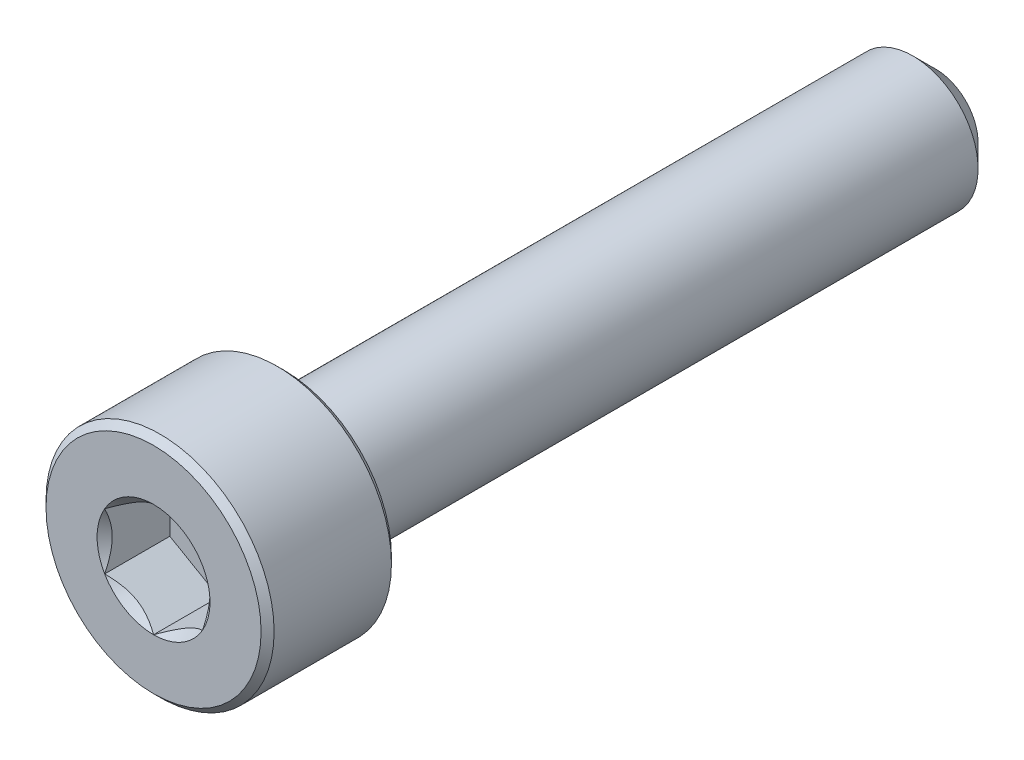
ISO-10303-21;
HEADER;
FILE_DESCRIPTION(('STEP AP214'),'2;1');
FILE_NAME('part.step','',(''),(''),'','','');
FILE_SCHEMA(('AUTOMOTIVE_DESIGN { 1 0 10303 214 1 1 1 1 }'));
ENDSEC;
DATA;
#1=APPLICATION_CONTEXT('core data for automotive mechanical design processes');
#2=APPLICATION_PROTOCOL_DEFINITION('international standard','automotive_design',2000,#1);
#3=PRODUCT_CONTEXT('',#1,'mechanical');
#4=PRODUCT('Part','Part','',(#3));
#5=PRODUCT_RELATED_PRODUCT_CATEGORY('part','',(#4));
#6=PRODUCT_DEFINITION_FORMATION('','',#4);
#7=PRODUCT_DEFINITION_CONTEXT('part definition',#1,'design');
#8=PRODUCT_DEFINITION('design','',#6,#7);
#9=PRODUCT_DEFINITION_SHAPE('','',#8);
#10=(LENGTH_UNIT() NAMED_UNIT(*) SI_UNIT(.MILLI.,.METRE.));
#11=(NAMED_UNIT(*) PLANE_ANGLE_UNIT() SI_UNIT($,.RADIAN.));
#12=(NAMED_UNIT(*) SI_UNIT($,.STERADIAN.) SOLID_ANGLE_UNIT());
#13=UNCERTAINTY_MEASURE_WITH_UNIT(LENGTH_MEASURE(1.E-05),#10,'distance_accuracy_value','');
#14=(GEOMETRIC_REPRESENTATION_CONTEXT(3) GLOBAL_UNCERTAINTY_ASSIGNED_CONTEXT((#13)) GLOBAL_UNIT_ASSIGNED_CONTEXT((#10,
#11,#12)) REPRESENTATION_CONTEXT('',''));
#15=CARTESIAN_POINT('',(0.,0.,0.));
#16=DIRECTION('',(0.,0.,1.));
#17=DIRECTION('',(1.,0.,0.));
#18=AXIS2_PLACEMENT_3D('',#15,#16,#17);
#19=CARTESIAN_POINT('',(0.,3.3,12.));
#20=DIRECTION('',(0.,0.,1.));
#21=DIRECTION('',(1.,0.,0.));
#22=AXIS2_PLACEMENT_3D('',#19,#20,#21);
#23=PLANE('',#22);
#24=CARTESIAN_POINT('',(0.,0.,12.));
#25=DIRECTION('',(0.,0.,1.));
#26=DIRECTION('',(1.,0.,0.));
#27=AXIS2_PLACEMENT_3D('',#24,#25,#26);
#28=CIRCLE('',#27,1.73205080756888);
#29=CARTESIAN_POINT('',(1.5,0.86602540378444,12.));
#30=VERTEX_POINT('',#29);
#31=CARTESIAN_POINT('',(0.,1.73205080756888,12.));
#32=VERTEX_POINT('',#31);
#33=EDGE_CURVE('E98',#30,#32,#28,.T.);
#34=ORIENTED_EDGE('',*,*,#33,.F.);
#35=CARTESIAN_POINT('',(1.5,-0.86602540378444,12.));
#36=VERTEX_POINT('',#35);
#37=EDGE_CURVE('E58',#36,#30,#28,.T.);
#38=ORIENTED_EDGE('',*,*,#37,.F.);
#39=CARTESIAN_POINT('',(0.,-1.73205080756888,12.));
#40=VERTEX_POINT('',#39);
#41=EDGE_CURVE('E308',#40,#36,#28,.T.);
#42=ORIENTED_EDGE('',*,*,#41,.F.);
#43=CARTESIAN_POINT('',(-1.5,-0.866025403784437,12.));
#44=VERTEX_POINT('',#43);
#45=EDGE_CURVE('E65',#44,#40,#28,.T.);
#46=ORIENTED_EDGE('',*,*,#45,.F.);
#47=CARTESIAN_POINT('',(-1.5,0.86602540378444,12.));
#48=VERTEX_POINT('',#47);
#49=EDGE_CURVE('E137',#48,#44,#28,.T.);
#50=ORIENTED_EDGE('',*,*,#49,.F.);
#51=EDGE_CURVE('E108',#32,#48,#28,.T.);
#52=ORIENTED_EDGE('',*,*,#51,.F.);
#53=EDGE_LOOP('',(#34,#38,#42,#46,#50,#52));
#54=FACE_BOUND('',#53,.T.);
#55=CARTESIAN_POINT('',(0.,0.,12.));
#56=DIRECTION('',(0.,0.,-1.));
#57=DIRECTION('',(-1.,0.,0.));
#58=AXIS2_PLACEMENT_3D('',#55,#56,#57);
#59=CIRCLE('',#58,3.3);
#60=CARTESIAN_POINT('',(-3.3,0.,12.));
#61=VERTEX_POINT('',#60);
#62=EDGE_CURVE('E52',#61,#61,#59,.T.);
#63=ORIENTED_EDGE('',*,*,#62,.F.);
#64=EDGE_LOOP('',(#63));
#65=FACE_BOUND('',#64,.T.);
#66=ADVANCED_FACE('F38',(#54,#65),#23,.T.);
#67=CARTESIAN_POINT('',(0.,0.,11.8));
#68=DIRECTION('',(0.,0.,-1.));
#69=DIRECTION('',(-1.,0.,0.));
#70=AXIS2_PLACEMENT_3D('',#67,#68,#69);
#71=CONICAL_SURFACE('',#70,3.5,0.785398163397449);
#72=ORIENTED_EDGE('',*,*,#62,.T.);
#73=EDGE_LOOP('',(#72));
#74=FACE_BOUND('',#73,.T.);
#75=CARTESIAN_POINT('',(0.,0.,11.8));
#76=DIRECTION('',(0.,0.,-1.));
#77=DIRECTION('',(-1.,0.,0.));
#78=AXIS2_PLACEMENT_3D('',#75,#76,#77);
#79=CIRCLE('',#78,3.5);
#80=CARTESIAN_POINT('',(-3.5,0.,11.8));
#81=VERTEX_POINT('',#80);
#82=EDGE_CURVE('E240',#81,#81,#79,.T.);
#83=ORIENTED_EDGE('',*,*,#82,.F.);
#84=EDGE_LOOP('',(#83));
#85=FACE_BOUND('',#84,.T.);
#86=ADVANCED_FACE('F247',(#74,#85),#71,.T.);
#87=CARTESIAN_POINT('',(0.,0.,-12.));
#88=DIRECTION('',(0.,0.,-1.));
#89=DIRECTION('',(-1.,0.,0.));
#90=AXIS2_PLACEMENT_3D('',#87,#88,#89);
#91=CYLINDRICAL_SURFACE('',#90,3.5);
#92=ORIENTED_EDGE('',*,*,#82,.T.);
#93=EDGE_LOOP('',(#92));
#94=FACE_BOUND('',#93,.T.);
#95=CARTESIAN_POINT('',(0.,0.,8.2));
#96=DIRECTION('',(0.,0.,-1.));
#97=DIRECTION('',(-1.,0.,0.));
#98=AXIS2_PLACEMENT_3D('',#95,#96,#97);
#99=CIRCLE('',#98,3.5);
#100=CARTESIAN_POINT('',(-3.5,0.,8.2));
#101=VERTEX_POINT('',#100);
#102=EDGE_CURVE('E236',#101,#101,#99,.T.);
#103=ORIENTED_EDGE('',*,*,#102,.F.);
#104=EDGE_LOOP('',(#103));
#105=FACE_BOUND('',#104,.T.);
#106=ADVANCED_FACE('F253',(#94,#105),#91,.T.);
#107=CARTESIAN_POINT('',(0.,0.,8.));
#108=DIRECTION('',(0.,0.,1.));
#109=DIRECTION('',(1.,0.,0.));
#110=AXIS2_PLACEMENT_3D('',#107,#108,#109);
#111=CONICAL_SURFACE('',#110,3.3,0.785398163397445);
#112=ORIENTED_EDGE('',*,*,#102,.T.);
#113=EDGE_LOOP('',(#112));
#114=FACE_BOUND('',#113,.T.);
#115=CARTESIAN_POINT('',(0.,0.,8.));
#116=DIRECTION('',(0.,0.,-1.));
#117=DIRECTION('',(-1.,0.,0.));
#118=AXIS2_PLACEMENT_3D('',#115,#116,#117);
#119=CIRCLE('',#118,3.3);
#120=CARTESIAN_POINT('',(-3.3,0.,8.));
#121=VERTEX_POINT('',#120);
#122=EDGE_CURVE('E232',#121,#121,#119,.T.);
#123=ORIENTED_EDGE('',*,*,#122,.F.);
#124=EDGE_LOOP('',(#123));
#125=FACE_BOUND('',#124,.T.);
#126=ADVANCED_FACE('F257',(#114,#125),#111,.T.);
#127=CARTESIAN_POINT('',(0.,3.3,8.));
#128=DIRECTION('',(0.,0.,-1.));
#129=DIRECTION('',(-1.,0.,0.));
#130=AXIS2_PLACEMENT_3D('',#127,#128,#129);
#131=PLANE('',#130);
#132=ORIENTED_EDGE('',*,*,#122,.T.);
#133=EDGE_LOOP('',(#132));
#134=FACE_BOUND('',#133,.T.);
#135=CARTESIAN_POINT('',(0.,0.,8.));
#136=DIRECTION('',(0.,0.,-1.));
#137=DIRECTION('',(-1.,0.,0.));
#138=AXIS2_PLACEMENT_3D('',#135,#136,#137);
#139=CIRCLE('',#138,2.);
#140=CARTESIAN_POINT('',(-2.,0.,8.));
#141=VERTEX_POINT('',#140);
#142=EDGE_CURVE('E228',#141,#141,#139,.T.);
#143=ORIENTED_EDGE('',*,*,#142,.F.);
#144=EDGE_LOOP('',(#143));
#145=FACE_BOUND('',#144,.T.);
#146=ADVANCED_FACE('F263',(#134,#145),#131,.T.);
#147=CARTESIAN_POINT('',(0.,0.,-12.));
#148=DIRECTION('',(0.,0.,-1.));
#149=DIRECTION('',(-1.,0.,0.));
#150=AXIS2_PLACEMENT_3D('',#147,#148,#149);
#151=CYLINDRICAL_SURFACE('',#150,2.);
#152=ORIENTED_EDGE('',*,*,#142,.T.);
#153=EDGE_LOOP('',(#152));
#154=FACE_BOUND('',#153,.T.);
#155=CARTESIAN_POINT('',(0.,0.,-11.3));
#156=DIRECTION('',(0.,0.,-1.));
#157=DIRECTION('',(-1.,0.,0.));
#158=AXIS2_PLACEMENT_3D('',#155,#156,#157);
#159=CIRCLE('',#158,2.);
#160=CARTESIAN_POINT('',(-2.,0.,-11.3));
#161=VERTEX_POINT('',#160);
#162=EDGE_CURVE('E224',#161,#161,#159,.T.);
#163=ORIENTED_EDGE('',*,*,#162,.F.);
#164=EDGE_LOOP('',(#163));
#165=FACE_BOUND('',#164,.T.);
#166=ADVANCED_FACE('F267',(#154,#165),#151,.T.);
#167=CARTESIAN_POINT('',(0.,0.,-12.));
#168=DIRECTION('',(0.,0.,1.));
#169=DIRECTION('',(1.,0.,0.));
#170=AXIS2_PLACEMENT_3D('',#167,#168,#169);
#171=CONICAL_SURFACE('',#170,1.3,0.785398163397442);
#172=ORIENTED_EDGE('',*,*,#162,.T.);
#173=EDGE_LOOP('',(#172));
#174=FACE_BOUND('',#173,.T.);
#175=CARTESIAN_POINT('',(0.,0.,-12.));
#176=DIRECTION('',(0.,0.,-1.));
#177=DIRECTION('',(-1.,0.,0.));
#178=AXIS2_PLACEMENT_3D('',#175,#176,#177);
#179=CIRCLE('',#178,1.3);
#180=CARTESIAN_POINT('',(-1.3,0.,-12.));
#181=VERTEX_POINT('',#180);
#182=EDGE_CURVE('E207',#181,#181,#179,.T.);
#183=ORIENTED_EDGE('',*,*,#182,.F.);
#184=EDGE_LOOP('',(#183));
#185=FACE_BOUND('',#184,.T.);
#186=ADVANCED_FACE('F270',(#174,#185),#171,.T.);
#187=CARTESIAN_POINT('',(0.,1.3,-12.));
#188=DIRECTION('',(0.,0.,-1.));
#189=DIRECTION('',(-1.,0.,0.));
#190=AXIS2_PLACEMENT_3D('',#187,#188,#189);
#191=PLANE('',#190);
#192=ORIENTED_EDGE('',*,*,#182,.T.);
#193=EDGE_LOOP('',(#192));
#194=FACE_BOUND('',#193,.T.);
#195=ADVANCED_FACE('F173',(#194),#191,.T.);
#196=CARTESIAN_POINT('',(0.,0.,12.));
#197=DIRECTION('',(0.,0.,1.));
#198=DIRECTION('',(1.,0.,0.));
#199=AXIS2_PLACEMENT_3D('',#196,#197,#198);
#200=CONICAL_SURFACE('',#199,1.73205080756888,0.78539816339745);
#201=ORIENTED_EDGE('',*,*,#51,.T.);
#202=CARTESIAN_POINT('',(0.000200000000000415,1.73216627762272,12.0001154816001));
#203=CARTESIAN_POINT('',(-0.0513677907370751,1.70239359975915,11.9703654760673));
#204=CARTESIAN_POINT('',(-0.1037979176652,1.67212305186355,11.9423624839103));
#205=CARTESIAN_POINT('',(-0.210709034055596,1.61039789003619,11.8910892304401));
#206=CARTESIAN_POINT('',(-0.26520019581466,1.57893740312614,11.8678475050444));
#207=CARTESIAN_POINT('',(-0.375079081357248,1.51549879897987,11.8280337289922));
#208=CARTESIAN_POINT('',(-0.430438809095199,1.4835368452681,11.8113615856709));
#209=CARTESIAN_POINT('',(-0.54237725747715,1.41890915196211,11.7856744568181));
#210=CARTESIAN_POINT('',(-0.598952556553008,1.38624538781118,11.7766402904789));
#211=CARTESIAN_POINT('',(-0.69645538951644,1.329952100953,11.7684890812269));
#212=CARTESIAN_POINT('',(-0.737256908280465,1.30639533311124,11.7672822529892));
#213=CARTESIAN_POINT('',(-0.818787969615858,1.25932335290194,11.7693140571623));
#214=CARTESIAN_POINT('',(-0.859517494314629,1.23580815085313,11.7725536707483));
#215=CARTESIAN_POINT('',(-0.940584402163415,1.18900414978427,11.783291985982));
#216=CARTESIAN_POINT('',(-0.980921384598287,1.1657155821172,11.7907946530187));
#217=CARTESIAN_POINT('',(-1.06091833691403,1.11952932016335,11.8096516119283));
#218=CARTESIAN_POINT('',(-1.10057800851621,1.09663179808786,11.8210075570186));
#219=CARTESIAN_POINT('',(-1.20216313477448,1.03798159809698,11.8547216475927));
#220=CARTESIAN_POINT('',(-1.26345855370969,1.00259267147465,11.8796218490934));
#221=CARTESIAN_POINT('',(-1.35358562846331,0.950557780604375,11.9216566532716));
#222=CARTESIAN_POINT('',(-1.38328513990772,0.933410759677148,11.9364251535591));
#223=CARTESIAN_POINT('',(-1.44213790138375,0.899432101996407,11.9673105659402));
#224=CARTESIAN_POINT('',(-1.47129140422064,0.88260031928571,11.9834268341217));
#225=CARTESIAN_POINT('',(-1.5002,0.865909933730601,12.0001154816001));
#226=B_SPLINE_CURVE_WITH_KNOTS('',3,(#202,#203,#204,#205,#206,#207,#208,#209,#210,#211,#212,
#213,#214,#215,#216,#217,#218,#219,#220,#221,#222,#223,#224,#225),.UNSPECIFIED.,.F.,.F.,(4,2,2,
2,2,2,2,2,2,2,2,4),(0.,0.199829143693304,0.400822987382388,0.59862372053818,0.795926240188889,
0.937113067959881,1.07833105577193,1.21968061668222,1.36109089931054,1.58570969637566,
1.69770705470964,1.80965120737194),.UNSPECIFIED.);
#227=EDGE_CURVE('E11',#32,#48,#226,.T.);
#228=ORIENTED_EDGE('',*,*,#227,.F.);
#229=EDGE_LOOP('',(#201,#228));
#230=FACE_BOUND('',#229,.T.);
#231=ADVANCED_FACE('F112',(#230),#200,.F.);
#232=ORIENTED_EDGE('',*,*,#49,.T.);
#233=CARTESIAN_POINT('',(-1.5,-1.70094076570699,12.5358115093375));
#234=CARTESIAN_POINT('',(-1.5,-1.65940339844307,12.5046624535631));
#235=CARTESIAN_POINT('',(-1.5,-1.61763176138548,12.4738266460381));
#236=CARTESIAN_POINT('',(-1.5,-1.53352581710889,12.4129100581704));
#237=CARTESIAN_POINT('',(-1.5,-1.49119136858461,12.3828294731344));
#238=CARTESIAN_POINT('',(-1.5,-1.36258344501966,12.2934848296331));
#239=CARTESIAN_POINT('',(-1.5,-1.27533705988673,12.2355978134878));
#240=CARTESIAN_POINT('',(-1.5,-1.09255216894207,12.1221956742968));
#241=CARTESIAN_POINT('',(-1.5,-0.996821581803493,12.0669865475731));
#242=CARTESIAN_POINT('',(-1.5,-0.800613082291591,11.9661637894456));
#243=CARTESIAN_POINT('',(-1.5,-0.700152604862087,11.9205178517796));
#244=CARTESIAN_POINT('',(-1.5,-0.549105960820993,11.8646825296987));
#245=CARTESIAN_POINT('',(-1.5,-0.50070074362804,11.8486143923262));
#246=CARTESIAN_POINT('',(-1.5,-0.402744695079411,11.8203677225147));
#247=CARTESIAN_POINT('',(-1.5,-0.353193782853662,11.8081894655512));
#248=CARTESIAN_POINT('',(-1.5,-0.254057869430009,11.7885509139904));
#249=CARTESIAN_POINT('',(-1.5,-0.204488814603775,11.7810113615859));
#250=CARTESIAN_POINT('',(-1.5,-0.104849462627796,11.7707932169289));
#251=CARTESIAN_POINT('',(-1.5,-0.0547792475757581,11.7681138411974));
#252=CARTESIAN_POINT('',(-1.5,0.0436737229088438,11.7678046268618));
#253=CARTESIAN_POINT('',(-1.5,0.0920560164094802,11.7700063307259));
#254=CARTESIAN_POINT('',(-1.5,0.188397733218518,11.7789725882362));
#255=CARTESIAN_POINT('',(-1.5,0.236357072029981,11.785738033594));
#256=CARTESIAN_POINT('',(-1.5,0.332310053939587,11.8035816390129));
#257=CARTESIAN_POINT('',(-1.5,0.380290051019947,11.8147320967868));
#258=CARTESIAN_POINT('',(-1.5,0.475204866701384,11.8407610618773));
#259=CARTESIAN_POINT('',(-1.5,0.522139781196709,11.8556392256008));
#260=CARTESIAN_POINT('',(-1.5,0.67113584923772,11.9084343926817));
#261=CARTESIAN_POINT('',(-1.5,0.771043708402958,11.9524144964364));
#262=CARTESIAN_POINT('',(-1.5,0.96615432077171,12.0501619481606));
#263=CARTESIAN_POINT('',(-1.5,1.06133841027247,12.1039647104964));
#264=CARTESIAN_POINT('',(-1.5,1.24322962123133,12.2149242663436));
#265=CARTESIAN_POINT('',(-1.5,1.33012275327054,12.2717798884629));
#266=CARTESIAN_POINT('',(-1.5,1.45814294533514,12.3596557398234));
#267=CARTESIAN_POINT('',(-1.5,1.50026316125082,12.3892542436258));
#268=CARTESIAN_POINT('',(-1.5,1.58392901779071,12.4492295725282));
#269=CARTESIAN_POINT('',(-1.5,1.62547481197907,12.4796061831648));
#270=CARTESIAN_POINT('',(-1.5,1.66678158585385,12.5103052870204));
#271=B_SPLINE_CURVE_WITH_KNOTS('',3,(#233,#234,#235,#236,#237,#238,#239,#240,#241,#242,#243,
#244,#245,#246,#247,#248,#249,#250,#251,#252,#253,#254,#255,#256,#257,#258,#259,#260,#261,#262,
#263,#264,#265,#266,#267,#268,#269,#270),.UNSPECIFIED.,.F.,.F.,(4,2,2,2,2,2,2,2,2,2,2,2,2,2,2,2,
2,2,4),(0.,0.155753948201002,0.311547769199352,0.625513832410581,0.956763614654479,
1.28687565594417,1.43975300144579,1.59264117109685,1.74283872260253,1.89301205954152,
2.03808349452257,2.1831832832956,2.33078307442231,2.47836926586908,2.80488410158813,
3.13260026706957,3.44396956433299,3.59840353500356,3.75279538879849),.UNSPECIFIED.);
#272=EDGE_CURVE('E107',#48,#44,#271,.F.);
#273=ORIENTED_EDGE('',*,*,#272,.F.);
#274=EDGE_LOOP('',(#232,#273));
#275=FACE_BOUND('',#274,.T.);
#276=ADVANCED_FACE('F285',(#275),#200,.F.);
#277=ORIENTED_EDGE('',*,*,#45,.T.);
#278=CARTESIAN_POINT('',(-1.5002,-0.865909933730601,12.0001154816001));
#279=CARTESIAN_POINT('',(-1.44863220926292,-0.895682611594166,11.9703654760673));
#280=CARTESIAN_POINT('',(-1.3962020823348,-0.925953159489765,11.9423624839103));
#281=CARTESIAN_POINT('',(-1.2892909659444,-0.987678321317123,11.8910892304401));
#282=CARTESIAN_POINT('',(-1.23479980418534,-1.01913880822717,11.8678475050444));
#283=CARTESIAN_POINT('',(-1.12492091864275,-1.08257741237344,11.8280337289922));
#284=CARTESIAN_POINT('',(-1.0695611909048,-1.11453936608521,11.8113615856709));
#285=CARTESIAN_POINT('',(-0.957622742522851,-1.1791670593912,11.7856744568181));
#286=CARTESIAN_POINT('',(-0.901047443446993,-1.21183082354213,11.7766402904789));
#287=CARTESIAN_POINT('',(-0.803544610483561,-1.26812411040032,11.7684890812269));
#288=CARTESIAN_POINT('',(-0.762743091719535,-1.29168087824208,11.7672822529892));
#289=CARTESIAN_POINT('',(-0.681212030384143,-1.33875285845138,11.7693140571623));
#290=CARTESIAN_POINT('',(-0.640482505685372,-1.36226806050018,11.7725536707483));
#291=CARTESIAN_POINT('',(-0.559415597836586,-1.40907206156905,11.783291985982));
#292=CARTESIAN_POINT('',(-0.519078615401714,-1.43236062923612,11.7907946530187));
#293=CARTESIAN_POINT('',(-0.439081663085971,-1.47854689118996,11.8096516119283));
#294=CARTESIAN_POINT('',(-0.399421991483794,-1.50144441326545,11.8210075570186));
#295=CARTESIAN_POINT('',(-0.297836865225516,-1.56009461325633,11.8547216475927));
#296=CARTESIAN_POINT('',(-0.236541446290312,-1.59548353987866,11.8796218490934));
#297=CARTESIAN_POINT('',(-0.146414371536687,-1.64751843074894,11.9216566532716));
#298=CARTESIAN_POINT('',(-0.116714860092283,-1.66466545167617,11.9364251535591));
#299=CARTESIAN_POINT('',(-0.0578620986162496,-1.69864410935691,11.9673105659402));
#300=CARTESIAN_POINT('',(-0.0287085957793634,-1.71547589206761,11.9834268341217));
#301=CARTESIAN_POINT('',(0.000199999999999558,-1.73216627762272,12.0001154816001));
#302=B_SPLINE_CURVE_WITH_KNOTS('',3,(#278,#279,#280,#281,#282,#283,#284,#285,#286,#287,#288,
#289,#290,#291,#292,#293,#294,#295,#296,#297,#298,#299,#300,#301),.UNSPECIFIED.,.F.,.F.,(4,2,2,
2,2,2,2,2,2,2,2,4),(0.,0.199829143693304,0.400822987382388,0.59862372053818,0.795926240188888,
0.93711306795988,1.07833105577193,1.21968061668222,1.36109089931054,1.58570969637565,
1.69770705470964,1.80965120737194),.UNSPECIFIED.);
#303=EDGE_CURVE('E149',#44,#40,#302,.T.);
#304=ORIENTED_EDGE('',*,*,#303,.F.);
#305=EDGE_LOOP('',(#277,#304));
#306=FACE_BOUND('',#305,.T.);
#307=ADVANCED_FACE('F289',(#306),#200,.F.);
#308=ORIENTED_EDGE('',*,*,#41,.T.);
#309=CARTESIAN_POINT('',(-0.000200000000000533,-1.73216627762272,12.0001154816001));
#310=CARTESIAN_POINT('',(0.051367790737075,-1.70239359975915,11.9703654760673));
#311=CARTESIAN_POINT('',(0.1037979176652,-1.67212305186355,11.9423624839103));
#312=CARTESIAN_POINT('',(0.210709034055596,-1.61039789003619,11.8910892304401));
#313=CARTESIAN_POINT('',(0.26520019581466,-1.57893740312614,11.8678475050444));
#314=CARTESIAN_POINT('',(0.375079081357248,-1.51549879897987,11.8280337289922));
#315=CARTESIAN_POINT('',(0.430438809095199,-1.4835368452681,11.8113615856709));
#316=CARTESIAN_POINT('',(0.54237725747715,-1.41890915196211,11.7856744568181));
#317=CARTESIAN_POINT('',(0.598952556553008,-1.38624538781118,11.7766402904789));
#318=CARTESIAN_POINT('',(0.69645538951644,-1.329952100953,11.7684890812269));
#319=CARTESIAN_POINT('',(0.737256908280465,-1.30639533311124,11.7672822529892));
#320=CARTESIAN_POINT('',(0.818787969615857,-1.25932335290194,11.7693140571623));
#321=CARTESIAN_POINT('',(0.859517494314629,-1.23580815085313,11.7725536707483));
#322=CARTESIAN_POINT('',(0.940584402163415,-1.18900414978427,11.783291985982));
#323=CARTESIAN_POINT('',(0.980921384598287,-1.1657155821172,11.7907946530187));
#324=CARTESIAN_POINT('',(1.06091833691403,-1.11952932016335,11.8096516119283));
#325=CARTESIAN_POINT('',(1.10057800851621,-1.09663179808786,11.8210075570186));
#326=CARTESIAN_POINT('',(1.20216313477448,-1.03798159809698,11.8547216475927));
#327=CARTESIAN_POINT('',(1.26345855370969,-1.00259267147465,11.8796218490934));
#328=CARTESIAN_POINT('',(1.35358562846331,-0.950557780604376,11.9216566532716));
#329=CARTESIAN_POINT('',(1.38328513990772,-0.933410759677149,11.9364251535591));
#330=CARTESIAN_POINT('',(1.44213790138375,-0.899432101996408,11.9673105659402));
#331=CARTESIAN_POINT('',(1.47129140422064,-0.882600319285711,11.9834268341217));
#332=CARTESIAN_POINT('',(1.5002,-0.865909933730602,12.0001154816001));
#333=B_SPLINE_CURVE_WITH_KNOTS('',3,(#309,#310,#311,#312,#313,#314,#315,#316,#317,#318,#319,
#320,#321,#322,#323,#324,#325,#326,#327,#328,#329,#330,#331,#332),.UNSPECIFIED.,.F.,.F.,(4,2,2,
2,2,2,2,2,2,2,2,4),(0.,0.199829143693305,0.400822987382388,0.598623720538181,0.795926240188889,
0.93711306795988,1.07833105577193,1.21968061668222,1.36109089931054,1.58570969637565,
1.69770705470963,1.80965120737194),.UNSPECIFIED.);
#334=EDGE_CURVE('E310',#40,#36,#333,.T.);
#335=ORIENTED_EDGE('',*,*,#334,.F.);
#336=EDGE_LOOP('',(#308,#335));
#337=FACE_BOUND('',#336,.T.);
#338=ADVANCED_FACE('F298',(#337),#200,.F.);
#339=ORIENTED_EDGE('',*,*,#37,.T.);
#340=CARTESIAN_POINT('',(1.5,-1.70094076506827,12.5358115088584));
#341=CARTESIAN_POINT('',(1.5,-1.65940339782208,12.5046624531024));
#342=CARTESIAN_POINT('',(1.5,-1.61763176078228,12.4738266455959));
#343=CARTESIAN_POINT('',(1.5,-1.53352581654145,12.4129100577648));
#344=CARTESIAN_POINT('',(1.5,-1.49119136803515,12.382829472747));
#345=CARTESIAN_POINT('',(1.5,-1.36258344452521,12.293484829301));
#346=CARTESIAN_POINT('',(1.5,-1.2753370594297,12.2355978131923));
#347=CARTESIAN_POINT('',(1.5,-1.09255216856664,12.1221956740766));
#348=CARTESIAN_POINT('',(1.5,-0.996821581472453,12.0669865473912));
#349=CARTESIAN_POINT('',(1.5,-0.800613082053125,11.9661637893348));
#350=CARTESIAN_POINT('',(1.5,-0.70015260467177,11.9205178517016));
#351=CARTESIAN_POINT('',(1.5,-0.549105960667007,11.8646825296453));
#352=CARTESIAN_POINT('',(1.5,-0.500700743459034,11.8486143922722));
#353=CARTESIAN_POINT('',(1.5,-0.402744694879906,11.8203677224624));
#354=CARTESIAN_POINT('',(1.5,-0.35319378263868,11.8081894655014));
#355=CARTESIAN_POINT('',(1.5,-0.254057869184596,11.7885509139489));
#356=CARTESIAN_POINT('',(1.5,-0.204488814343417,11.7810113615502));
#357=CARTESIAN_POINT('',(1.5,-0.104849462338083,11.7707932169081));
#358=CARTESIAN_POINT('',(1.5,-0.054779247271636,11.7681138411859));
#359=CARTESIAN_POINT('',(1.5,0.0436737232403028,11.767804626871));
#360=CARTESIAN_POINT('',(1.5,0.0920560167539032,11.7700063307466));
#361=CARTESIAN_POINT('',(1.5,0.188397733587633,11.7789725882818));
#362=CARTESIAN_POINT('',(1.5,0.236357072410824,11.7857380336531));
#363=CARTESIAN_POINT('',(1.5,0.332310054343575,11.8035816391));
#364=CARTESIAN_POINT('',(1.5,0.380290051435318,11.8147320968888));
#365=CARTESIAN_POINT('',(1.5,0.475204867138458,11.8407610620092));
#366=CARTESIAN_POINT('',(1.5,0.522139781644104,11.8556392257479));
#367=CARTESIAN_POINT('',(1.5,0.671135849783408,11.9084343929006));
#368=CARTESIAN_POINT('',(1.5,0.771043709031689,11.9524144967216));
#369=CARTESIAN_POINT('',(1.5,0.96615432156016,12.0501619485856));
#370=CARTESIAN_POINT('',(1.5,1.06133841113756,12.103964710995));
#371=CARTESIAN_POINT('',(1.5,1.24322962223427,12.214924266983));
#372=CARTESIAN_POINT('',(1.5,1.33012275433518,12.2717798891689));
#373=CARTESIAN_POINT('',(1.5,1.45814294649102,12.359655740629));
#374=CARTESIAN_POINT('',(1.5,1.50026316243668,12.3892542444644));
#375=CARTESIAN_POINT('',(1.5,1.58392901903632,12.4492295734326));
#376=CARTESIAN_POINT('',(1.5,1.62547481325447,12.4796061841021));
#377=CARTESIAN_POINT('',(1.5,1.66678158715899,12.5103052879905));
#378=B_SPLINE_CURVE_WITH_KNOTS('',3,(#340,#341,#342,#343,#344,#345,#346,#347,#348,#349,#350,
#351,#352,#353,#354,#355,#356,#357,#358,#359,#360,#361,#362,#363,#364,#365,#366,#367,#368,#369,
#370,#371,#372,#373,#374,#375,#376,#377),.UNSPECIFIED.,.F.,.F.,(4,2,2,2,2,2,2,2,2,2,2,2,2,2,2,2,
2,2,4),(0.,0.155753948125309,0.311547769047944,0.625513832104917,0.956763614176022,
1.28687565529455,1.43975300083937,1.59264117053357,1.74283872208071,1.89301205906115,
2.03808349408246,2.18318328289585,2.33078307406584,2.47836926555587,2.80488410158167,
3.13260026737189,3.44396956489968,3.59840353570064,3.75279538962595),.UNSPECIFIED.);
#379=EDGE_CURVE('E125',#36,#30,#378,.T.);
#380=ORIENTED_EDGE('',*,*,#379,.F.);
#381=EDGE_LOOP('',(#339,#380));
#382=FACE_BOUND('',#381,.T.);
#383=ADVANCED_FACE('F292',(#382),#200,.F.);
#384=ORIENTED_EDGE('',*,*,#33,.T.);
#385=CARTESIAN_POINT('',(1.5002,0.865909933730602,12.0001154816001));
#386=CARTESIAN_POINT('',(1.44863220926292,0.895682611594167,11.9703654760673));
#387=CARTESIAN_POINT('',(1.3962020823348,0.925953159489766,11.9423624839103));
#388=CARTESIAN_POINT('',(1.2892909659444,0.987678321317125,11.8910892304401));
#389=CARTESIAN_POINT('',(1.23479980418534,1.01913880822718,11.8678475050444));
#390=CARTESIAN_POINT('',(1.12492091864275,1.08257741237344,11.8280337289922));
#391=CARTESIAN_POINT('',(1.0695611909048,1.11453936608522,11.8113615856709));
#392=CARTESIAN_POINT('',(0.957622742522848,1.1791670593912,11.7856744568181));
#393=CARTESIAN_POINT('',(0.90104744344699,1.21183082354213,11.7766402904789));
#394=CARTESIAN_POINT('',(0.803544610483558,1.26812411040032,11.7684890812269));
#395=CARTESIAN_POINT('',(0.762743091719533,1.29168087824208,11.7672822529892));
#396=CARTESIAN_POINT('',(0.681212030384141,1.33875285845138,11.7693140571623));
#397=CARTESIAN_POINT('',(0.640482505685369,1.36226806050018,11.7725536707483));
#398=CARTESIAN_POINT('',(0.559415597836583,1.40907206156905,11.783291985982));
#399=CARTESIAN_POINT('',(0.519078615401711,1.43236062923612,11.7907946530187));
#400=CARTESIAN_POINT('',(0.439081663085968,1.47854689118997,11.8096516119283));
#401=CARTESIAN_POINT('',(0.399421991483791,1.50144441326545,11.8210075570186));
#402=CARTESIAN_POINT('',(0.297836865225514,1.56009461325633,11.8547216475927));
#403=CARTESIAN_POINT('',(0.23654144629031,1.59548353987866,11.8796218490934));
#404=CARTESIAN_POINT('',(0.146414371536687,1.64751843074894,11.9216566532716));
#405=CARTESIAN_POINT('',(0.116714860092283,1.66466545167617,11.9364251535591));
#406=CARTESIAN_POINT('',(0.0578620986162495,1.69864410935691,11.9673105659402));
#407=CARTESIAN_POINT('',(0.028708595779363,1.71547589206761,11.9834268341217));
#408=CARTESIAN_POINT('',(-0.000199999999999666,1.73216627762272,12.0001154816001));
#409=B_SPLINE_CURVE_WITH_KNOTS('',3,(#385,#386,#387,#388,#389,#390,#391,#392,#393,#394,#395,
#396,#397,#398,#399,#400,#401,#402,#403,#404,#405,#406,#407,#408),.UNSPECIFIED.,.F.,.F.,(4,2,2,
2,2,2,2,2,2,2,2,4),(0.,0.199829143693304,0.400822987382389,0.598623720538181,0.795926240188889,
0.937113067959881,1.07833105577193,1.21968061668222,1.36109089931055,1.58570969637565,
1.69770705470963,1.80965120737194),.UNSPECIFIED.);
#410=EDGE_CURVE('E102',#30,#32,#409,.T.);
#411=ORIENTED_EDGE('',*,*,#410,.F.);
#412=EDGE_LOOP('',(#384,#411));
#413=FACE_BOUND('',#412,.T.);
#414=ADVANCED_FACE('F100',(#413),#200,.F.);
#415=CARTESIAN_POINT('',(0.,0.,10.));
#416=DIRECTION('',(0.,0.,1.));
#417=DIRECTION('',(1.,0.,0.));
#418=AXIS2_PLACEMENT_3D('',#415,#416,#417);
#419=PLANE('',#418);
#420=DIRECTION('',(-0.866025403784439,0.5,0.));
#421=VECTOR('',#420,1.);
#422=CARTESIAN_POINT('',(1.5,0.86602540378444,10.));
#423=LINE('',#422,#421);
#424=CARTESIAN_POINT('',(1.5,0.86602540378444,10.));
#425=VERTEX_POINT('',#424);
#426=CARTESIAN_POINT('',(0.,1.73205080756888,10.));
#427=VERTEX_POINT('',#426);
#428=EDGE_CURVE('E124',#425,#427,#423,.T.);
#429=ORIENTED_EDGE('',*,*,#428,.T.);
#430=DIRECTION('',(-0.866025403784439,-0.5,0.));
#431=VECTOR('',#430,1.);
#432=CARTESIAN_POINT('',(0.,1.73205080756888,10.));
#433=LINE('',#432,#431);
#434=CARTESIAN_POINT('',(-1.5,0.866025403784439,10.));
#435=VERTEX_POINT('',#434);
#436=EDGE_CURVE('E129',#427,#435,#433,.T.);
#437=ORIENTED_EDGE('',*,*,#436,.T.);
#438=DIRECTION('',(0.,-1.,0.));
#439=VECTOR('',#438,1.);
#440=CARTESIAN_POINT('',(-1.5,0.866025403784439,10.));
#441=LINE('',#440,#439);
#442=CARTESIAN_POINT('',(-1.5,-0.866025403784439,10.));
#443=VERTEX_POINT('',#442);
#444=EDGE_CURVE('E190',#435,#443,#441,.T.);
#445=ORIENTED_EDGE('',*,*,#444,.T.);
#446=DIRECTION('',(0.866025403784439,-0.5,0.));
#447=VECTOR('',#446,1.);
#448=CARTESIAN_POINT('',(-1.5,-0.866025403784439,10.));
#449=LINE('',#448,#447);
#450=CARTESIAN_POINT('',(0.,-1.73205080756888,10.));
#451=VERTEX_POINT('',#450);
#452=EDGE_CURVE('E194',#443,#451,#449,.T.);
#453=ORIENTED_EDGE('',*,*,#452,.T.);
#454=DIRECTION('',(0.866025403784439,0.5,0.));
#455=VECTOR('',#454,1.);
#456=CARTESIAN_POINT('',(0.,-1.73205080756888,10.));
#457=LINE('',#456,#455);
#458=CARTESIAN_POINT('',(1.5,-0.86602540378444,10.));
#459=VERTEX_POINT('',#458);
#460=EDGE_CURVE('E198',#451,#459,#457,.T.);
#461=ORIENTED_EDGE('',*,*,#460,.T.);
#462=DIRECTION('',(0.,1.,0.));
#463=VECTOR('',#462,1.);
#464=CARTESIAN_POINT('',(1.5,-0.86602540378444,10.));
#465=LINE('',#464,#463);
#466=EDGE_CURVE('E133',#459,#425,#465,.T.);
#467=ORIENTED_EDGE('',*,*,#466,.T.);
#468=EDGE_LOOP('',(#429,#437,#445,#453,#461,#467));
#469=FACE_BOUND('',#468,.T.);
#470=ADVANCED_FACE('F168',(#469),#419,.T.);
#471=CARTESIAN_POINT('',(0.,1.73205080756888,10.));
#472=DIRECTION('',(-0.5,0.866025403784439,0.));
#473=DIRECTION('',(-0.866025403784439,-0.5,0.));
#474=AXIS2_PLACEMENT_3D('',#471,#472,#473);
#475=PLANE('',#474);
#476=DIRECTION('',(0.,0.,1.));
#477=VECTOR('',#476,1.);
#478=CARTESIAN_POINT('',(0.,1.73205080756888,10.));
#479=LINE('',#478,#477);
#480=EDGE_CURVE('E120',#427,#32,#479,.T.);
#481=ORIENTED_EDGE('',*,*,#480,.T.);
#482=ORIENTED_EDGE('',*,*,#227,.T.);
#483=DIRECTION('',(0.,0.,1.));
#484=VECTOR('',#483,1.);
#485=CARTESIAN_POINT('',(-1.5,0.866025403784439,10.));
#486=LINE('',#485,#484);
#487=EDGE_CURVE('E132',#435,#48,#486,.T.);
#488=ORIENTED_EDGE('',*,*,#487,.F.);
#489=ORIENTED_EDGE('',*,*,#436,.F.);
#490=EDGE_LOOP('',(#481,#482,#488,#489));
#491=FACE_BOUND('',#490,.T.);
#492=ADVANCED_FACE('F127',(#491),#475,.F.);
#493=CARTESIAN_POINT('',(-1.5,0.866025403784439,10.));
#494=DIRECTION('',(-1.,0.,0.));
#495=DIRECTION('',(0.,-1.,0.));
#496=AXIS2_PLACEMENT_3D('',#493,#494,#495);
#497=PLANE('',#496);
#498=ORIENTED_EDGE('',*,*,#487,.T.);
#499=ORIENTED_EDGE('',*,*,#272,.T.);
#500=DIRECTION('',(0.,0.,1.));
#501=VECTOR('',#500,1.);
#502=CARTESIAN_POINT('',(-1.5,-0.866025403784439,10.));
#503=LINE('',#502,#501);
#504=EDGE_CURVE('E215',#443,#44,#503,.T.);
#505=ORIENTED_EDGE('',*,*,#504,.F.);
#506=ORIENTED_EDGE('',*,*,#444,.F.);
#507=EDGE_LOOP('',(#498,#499,#505,#506));
#508=FACE_BOUND('',#507,.T.);
#509=ADVANCED_FACE('F158',(#508),#497,.F.);
#510=CARTESIAN_POINT('',(-1.5,-0.866025403784439,10.));
#511=DIRECTION('',(-0.5,-0.866025403784439,0.));
#512=DIRECTION('',(0.866025403784439,-0.5,0.));
#513=AXIS2_PLACEMENT_3D('',#510,#511,#512);
#514=PLANE('',#513);
#515=ORIENTED_EDGE('',*,*,#504,.T.);
#516=ORIENTED_EDGE('',*,*,#303,.T.);
#517=DIRECTION('',(0.,0.,1.));
#518=VECTOR('',#517,1.);
#519=CARTESIAN_POINT('',(0.,-1.73205080756888,10.));
#520=LINE('',#519,#518);
#521=EDGE_CURVE('E211',#451,#40,#520,.T.);
#522=ORIENTED_EDGE('',*,*,#521,.F.);
#523=ORIENTED_EDGE('',*,*,#452,.F.);
#524=EDGE_LOOP('',(#515,#516,#522,#523));
#525=FACE_BOUND('',#524,.T.);
#526=ADVANCED_FACE('F161',(#525),#514,.F.);
#527=CARTESIAN_POINT('',(0.,-1.73205080756888,10.));
#528=DIRECTION('',(0.5,-0.866025403784439,0.));
#529=DIRECTION('',(0.866025403784439,0.5,0.));
#530=AXIS2_PLACEMENT_3D('',#527,#528,#529);
#531=PLANE('',#530);
#532=ORIENTED_EDGE('',*,*,#521,.T.);
#533=ORIENTED_EDGE('',*,*,#334,.T.);
#534=DIRECTION('',(0.,0.,1.));
#535=VECTOR('',#534,1.);
#536=CARTESIAN_POINT('',(1.5,-0.86602540378444,10.));
#537=LINE('',#536,#535);
#538=EDGE_CURVE('E208',#459,#36,#537,.T.);
#539=ORIENTED_EDGE('',*,*,#538,.F.);
#540=ORIENTED_EDGE('',*,*,#460,.F.);
#541=EDGE_LOOP('',(#532,#533,#539,#540));
#542=FACE_BOUND('',#541,.T.);
#543=ADVANCED_FACE('F321',(#542),#531,.F.);
#544=CARTESIAN_POINT('',(1.5,-0.86602540378444,10.));
#545=DIRECTION('',(1.,0.,0.));
#546=DIRECTION('',(0.,0.,-1.));
#547=AXIS2_PLACEMENT_3D('',#544,#545,#546);
#548=PLANE('',#547);
#549=ORIENTED_EDGE('',*,*,#538,.T.);
#550=ORIENTED_EDGE('',*,*,#379,.T.);
#551=DIRECTION('',(0.,0.,1.));
#552=VECTOR('',#551,1.);
#553=CARTESIAN_POINT('',(1.5,0.86602540378444,10.));
#554=LINE('',#553,#552);
#555=EDGE_CURVE('E122',#425,#30,#554,.T.);
#556=ORIENTED_EDGE('',*,*,#555,.F.);
#557=ORIENTED_EDGE('',*,*,#466,.F.);
#558=EDGE_LOOP('',(#549,#550,#556,#557));
#559=FACE_BOUND('',#558,.T.);
#560=ADVANCED_FACE('F172',(#559),#548,.F.);
#561=CARTESIAN_POINT('',(1.5,0.86602540378444,10.));
#562=DIRECTION('',(0.5,0.866025403784439,0.));
#563=DIRECTION('',(-0.866025403784439,0.5,0.));
#564=AXIS2_PLACEMENT_3D('',#561,#562,#563);
#565=PLANE('',#564);
#566=ORIENTED_EDGE('',*,*,#555,.T.);
#567=ORIENTED_EDGE('',*,*,#410,.T.);
#568=ORIENTED_EDGE('',*,*,#480,.F.);
#569=ORIENTED_EDGE('',*,*,#428,.F.);
#570=EDGE_LOOP('',(#566,#567,#568,#569));
#571=FACE_BOUND('',#570,.T.);
#572=ADVANCED_FACE('F118',(#571),#565,.F.);
#573=CLOSED_SHELL('',(#66,#86,#106,#126,#146,#166,#186,#195,#231,#276,#307,#338,#383,#414,#470,
#492,#509,#526,#543,#560,#572));
#574=MANIFOLD_SOLID_BREP('B2',#573);
#575=ADVANCED_BREP_SHAPE_REPRESENTATION('',(#18,#574),#14);
#576=SHAPE_DEFINITION_REPRESENTATION(#9,#575);
ENDSEC;
END-ISO-10303-21;
